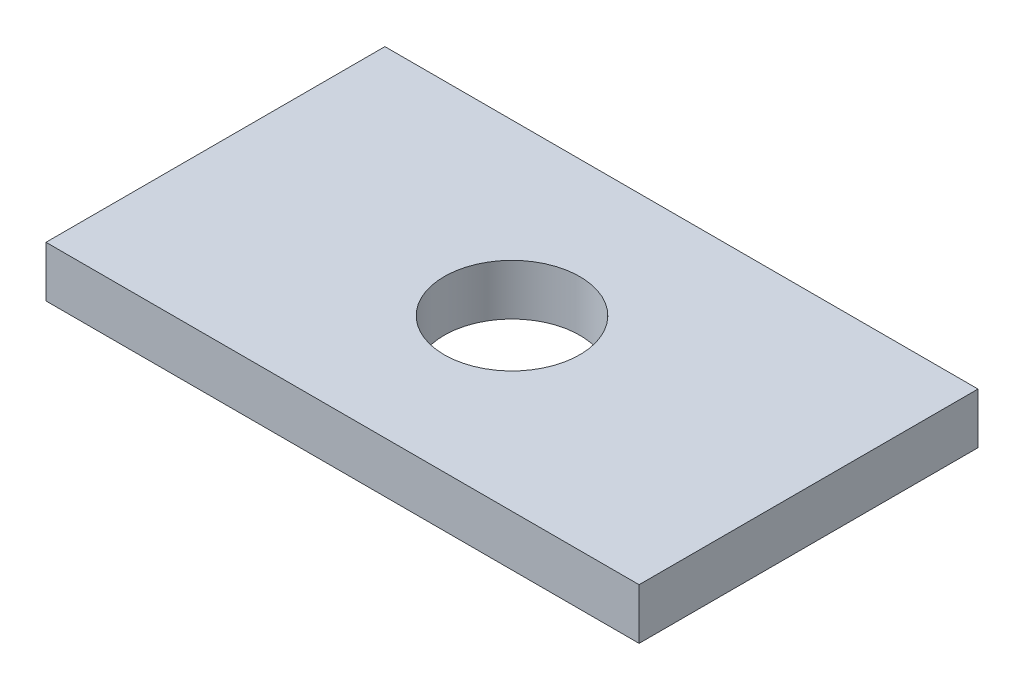
ISO-10303-21;
HEADER;
FILE_DESCRIPTION(('STEP AP214'),'2;1');
FILE_NAME('part.step','',(''),(''),'','','');
FILE_SCHEMA(('AUTOMOTIVE_DESIGN { 1 0 10303 214 1 1 1 1 }'));
ENDSEC;
DATA;
#1=APPLICATION_CONTEXT('core data for automotive mechanical design processes');
#2=APPLICATION_PROTOCOL_DEFINITION('international standard','automotive_design',2000,#1);
#3=PRODUCT_CONTEXT('',#1,'mechanical');
#4=PRODUCT('Part','Part','',(#3));
#5=PRODUCT_RELATED_PRODUCT_CATEGORY('part','',(#4));
#6=PRODUCT_DEFINITION_FORMATION('','',#4);
#7=PRODUCT_DEFINITION_CONTEXT('part definition',#1,'design');
#8=PRODUCT_DEFINITION('design','',#6,#7);
#9=PRODUCT_DEFINITION_SHAPE('','',#8);
#10=(LENGTH_UNIT() NAMED_UNIT(*) SI_UNIT(.MILLI.,.METRE.));
#11=(NAMED_UNIT(*) PLANE_ANGLE_UNIT() SI_UNIT($,.RADIAN.));
#12=(NAMED_UNIT(*) SI_UNIT($,.STERADIAN.) SOLID_ANGLE_UNIT());
#13=UNCERTAINTY_MEASURE_WITH_UNIT(LENGTH_MEASURE(1.E-05),#10,'distance_accuracy_value','');
#14=(GEOMETRIC_REPRESENTATION_CONTEXT(3) GLOBAL_UNCERTAINTY_ASSIGNED_CONTEXT((#13)) GLOBAL_UNIT_ASSIGNED_CONTEXT((#10,
#11,#12)) REPRESENTATION_CONTEXT('',''));
#15=CARTESIAN_POINT('',(0.,0.,0.));
#16=DIRECTION('',(0.,0.,1.));
#17=DIRECTION('',(1.,0.,0.));
#18=AXIS2_PLACEMENT_3D('',#15,#16,#17);
#19=CARTESIAN_POINT('',(35.,-3.,40.));
#20=DIRECTION('',(-1.,0.,0.));
#21=DIRECTION('',(0.,0.,1.));
#22=AXIS2_PLACEMENT_3D('',#19,#20,#21);
#23=PLANE('',#22);
#24=DIRECTION('',(0.,1.,0.));
#25=VECTOR('',#24,1.);
#26=CARTESIAN_POINT('',(35.,-3.,0.));
#27=LINE('',#26,#25);
#28=CARTESIAN_POINT('',(35.,-3.,0.));
#29=VERTEX_POINT('',#28);
#30=CARTESIAN_POINT('',(35.,3.,0.));
#31=VERTEX_POINT('',#30);
#32=EDGE_CURVE('E96',#29,#31,#27,.T.);
#33=ORIENTED_EDGE('',*,*,#32,.T.);
#34=DIRECTION('',(0.,0.,-1.));
#35=VECTOR('',#34,1.);
#36=CARTESIAN_POINT('',(35.,3.,40.));
#37=LINE('',#36,#35);
#38=CARTESIAN_POINT('',(35.,3.,40.));
#39=VERTEX_POINT('',#38);
#40=EDGE_CURVE('E11',#39,#31,#37,.T.);
#41=ORIENTED_EDGE('',*,*,#40,.F.);
#42=DIRECTION('',(0.,1.,0.));
#43=VECTOR('',#42,1.);
#44=CARTESIAN_POINT('',(35.,-3.,40.));
#45=LINE('',#44,#43);
#46=CARTESIAN_POINT('',(35.,-3.,40.));
#47=VERTEX_POINT('',#46);
#48=EDGE_CURVE('E84',#47,#39,#45,.T.);
#49=ORIENTED_EDGE('',*,*,#48,.F.);
#50=DIRECTION('',(0.,0.,-1.));
#51=VECTOR('',#50,1.);
#52=CARTESIAN_POINT('',(35.,-3.,40.));
#53=LINE('',#52,#51);
#54=EDGE_CURVE('E92',#47,#29,#53,.T.);
#55=ORIENTED_EDGE('',*,*,#54,.T.);
#56=EDGE_LOOP('',(#33,#41,#49,#55));
#57=FACE_BOUND('',#56,.T.);
#58=ADVANCED_FACE('F33',(#57),#23,.F.);
#59=CARTESIAN_POINT('',(-35.,3.,40.));
#60=DIRECTION('',(0.,-1.,0.));
#61=DIRECTION('',(0.,0.,-1.));
#62=AXIS2_PLACEMENT_3D('',#59,#60,#61);
#63=PLANE('',#62);
#64=CARTESIAN_POINT('',(0.,3.,20.));
#65=DIRECTION('',(0.,1.,0.));
#66=DIRECTION('',(0.,0.,1.));
#67=AXIS2_PLACEMENT_3D('',#64,#65,#66);
#68=CIRCLE('',#67,8.);
#69=CARTESIAN_POINT('',(0.,3.,28.));
#70=VERTEX_POINT('',#69);
#71=EDGE_CURVE('E110',#70,#70,#68,.T.);
#72=ORIENTED_EDGE('',*,*,#71,.F.);
#73=EDGE_LOOP('',(#72));
#74=FACE_BOUND('',#73,.T.);
#75=DIRECTION('',(-1.,0.,0.));
#76=VECTOR('',#75,1.);
#77=CARTESIAN_POINT('',(-35.,3.,0.));
#78=LINE('',#77,#76);
#79=CARTESIAN_POINT('',(-35.,3.,0.));
#80=VERTEX_POINT('',#79);
#81=EDGE_CURVE('E88',#31,#80,#78,.T.);
#82=ORIENTED_EDGE('',*,*,#81,.T.);
#83=DIRECTION('',(0.,0.,-1.));
#84=VECTOR('',#83,1.);
#85=CARTESIAN_POINT('',(-35.,3.,40.));
#86=LINE('',#85,#84);
#87=CARTESIAN_POINT('',(-35.,3.,40.));
#88=VERTEX_POINT('',#87);
#89=EDGE_CURVE('E41',#88,#80,#86,.T.);
#90=ORIENTED_EDGE('',*,*,#89,.F.);
#91=DIRECTION('',(-1.,0.,0.));
#92=VECTOR('',#91,1.);
#93=CARTESIAN_POINT('',(-35.,3.,40.));
#94=LINE('',#93,#92);
#95=EDGE_CURVE('E79',#39,#88,#94,.T.);
#96=ORIENTED_EDGE('',*,*,#95,.F.);
#97=ORIENTED_EDGE('',*,*,#40,.T.);
#98=EDGE_LOOP('',(#82,#90,#96,#97));
#99=FACE_BOUND('',#98,.T.);
#100=ADVANCED_FACE('F87',(#74,#99),#63,.F.);
#101=CARTESIAN_POINT('',(-35.,-3.,40.));
#102=DIRECTION('',(1.,0.,0.));
#103=DIRECTION('',(0.,0.,-1.));
#104=AXIS2_PLACEMENT_3D('',#101,#102,#103);
#105=PLANE('',#104);
#106=DIRECTION('',(0.,-1.,0.));
#107=VECTOR('',#106,1.);
#108=CARTESIAN_POINT('',(-35.,-3.,0.));
#109=LINE('',#108,#107);
#110=CARTESIAN_POINT('',(-35.,-3.,0.));
#111=VERTEX_POINT('',#110);
#112=EDGE_CURVE('E66',#80,#111,#109,.T.);
#113=ORIENTED_EDGE('',*,*,#112,.T.);
#114=DIRECTION('',(0.,0.,-1.));
#115=VECTOR('',#114,1.);
#116=CARTESIAN_POINT('',(-35.,-3.,40.));
#117=LINE('',#116,#115);
#118=CARTESIAN_POINT('',(-35.,-3.,40.));
#119=VERTEX_POINT('',#118);
#120=EDGE_CURVE('E89',#119,#111,#117,.T.);
#121=ORIENTED_EDGE('',*,*,#120,.F.);
#122=DIRECTION('',(0.,-1.,0.));
#123=VECTOR('',#122,1.);
#124=CARTESIAN_POINT('',(-35.,-3.,40.));
#125=LINE('',#124,#123);
#126=EDGE_CURVE('E82',#88,#119,#125,.T.);
#127=ORIENTED_EDGE('',*,*,#126,.F.);
#128=ORIENTED_EDGE('',*,*,#89,.T.);
#129=EDGE_LOOP('',(#113,#121,#127,#128));
#130=FACE_BOUND('',#129,.T.);
#131=ADVANCED_FACE('F90',(#130),#105,.F.);
#132=CARTESIAN_POINT('',(-35.,-3.,40.));
#133=DIRECTION('',(0.,1.,0.));
#134=DIRECTION('',(0.,0.,1.));
#135=AXIS2_PLACEMENT_3D('',#132,#133,#134);
#136=PLANE('',#135);
#137=CARTESIAN_POINT('',(0.,-3.,20.));
#138=DIRECTION('',(0.,1.,0.));
#139=DIRECTION('',(0.,0.,1.));
#140=AXIS2_PLACEMENT_3D('',#137,#138,#139);
#141=CIRCLE('',#140,8.);
#142=CARTESIAN_POINT('',(0.,-3.,28.));
#143=VERTEX_POINT('',#142);
#144=EDGE_CURVE('E99',#143,#143,#141,.T.);
#145=ORIENTED_EDGE('',*,*,#144,.T.);
#146=EDGE_LOOP('',(#145));
#147=FACE_BOUND('',#146,.T.);
#148=DIRECTION('',(1.,0.,0.));
#149=VECTOR('',#148,1.);
#150=CARTESIAN_POINT('',(-35.,-3.,0.));
#151=LINE('',#150,#149);
#152=EDGE_CURVE('E72',#111,#29,#151,.T.);
#153=ORIENTED_EDGE('',*,*,#152,.T.);
#154=ORIENTED_EDGE('',*,*,#54,.F.);
#155=DIRECTION('',(1.,0.,0.));
#156=VECTOR('',#155,1.);
#157=CARTESIAN_POINT('',(-35.,-3.,40.));
#158=LINE('',#157,#156);
#159=EDGE_CURVE('E49',#119,#47,#158,.T.);
#160=ORIENTED_EDGE('',*,*,#159,.F.);
#161=ORIENTED_EDGE('',*,*,#120,.T.);
#162=EDGE_LOOP('',(#153,#154,#160,#161));
#163=FACE_BOUND('',#162,.T.);
#164=ADVANCED_FACE('F104',(#147,#163),#136,.F.);
#165=CARTESIAN_POINT('',(0.,0.,40.));
#166=DIRECTION('',(0.,0.,-1.));
#167=DIRECTION('',(-1.,0.,0.));
#168=AXIS2_PLACEMENT_3D('',#165,#166,#167);
#169=PLANE('',#168);
#170=ORIENTED_EDGE('',*,*,#48,.T.);
#171=ORIENTED_EDGE('',*,*,#95,.T.);
#172=ORIENTED_EDGE('',*,*,#126,.T.);
#173=ORIENTED_EDGE('',*,*,#159,.T.);
#174=EDGE_LOOP('',(#170,#171,#172,#173));
#175=FACE_BOUND('',#174,.T.);
#176=ADVANCED_FACE('F80',(#175),#169,.F.);
#177=CARTESIAN_POINT('',(0.,0.,0.));
#178=DIRECTION('',(0.,0.,-1.));
#179=DIRECTION('',(-1.,0.,0.));
#180=AXIS2_PLACEMENT_3D('',#177,#178,#179);
#181=PLANE('',#180);
#182=ORIENTED_EDGE('',*,*,#32,.F.);
#183=ORIENTED_EDGE('',*,*,#152,.F.);
#184=ORIENTED_EDGE('',*,*,#112,.F.);
#185=ORIENTED_EDGE('',*,*,#81,.F.);
#186=EDGE_LOOP('',(#182,#183,#184,#185));
#187=FACE_BOUND('',#186,.T.);
#188=ADVANCED_FACE('F107',(#187),#181,.T.);
#189=CARTESIAN_POINT('',(0.,-3.,20.));
#190=DIRECTION('',(0.,1.,0.));
#191=DIRECTION('',(0.,0.,1.));
#192=AXIS2_PLACEMENT_3D('',#189,#190,#191);
#193=CYLINDRICAL_SURFACE('',#192,8.);
#194=ORIENTED_EDGE('',*,*,#144,.F.);
#195=EDGE_LOOP('',(#194));
#196=FACE_BOUND('',#195,.T.);
#197=ORIENTED_EDGE('',*,*,#71,.T.);
#198=EDGE_LOOP('',(#197));
#199=FACE_BOUND('',#198,.T.);
#200=ADVANCED_FACE('F117',(#196,#199),#193,.F.);
#201=CLOSED_SHELL('',(#58,#100,#131,#164,#176,#188,#200));
#202=MANIFOLD_SOLID_BREP('B2',#201);
#203=ADVANCED_BREP_SHAPE_REPRESENTATION('',(#18,#202),#14);
#204=SHAPE_DEFINITION_REPRESENTATION(#9,#203);
ENDSEC;
END-ISO-10303-21;
